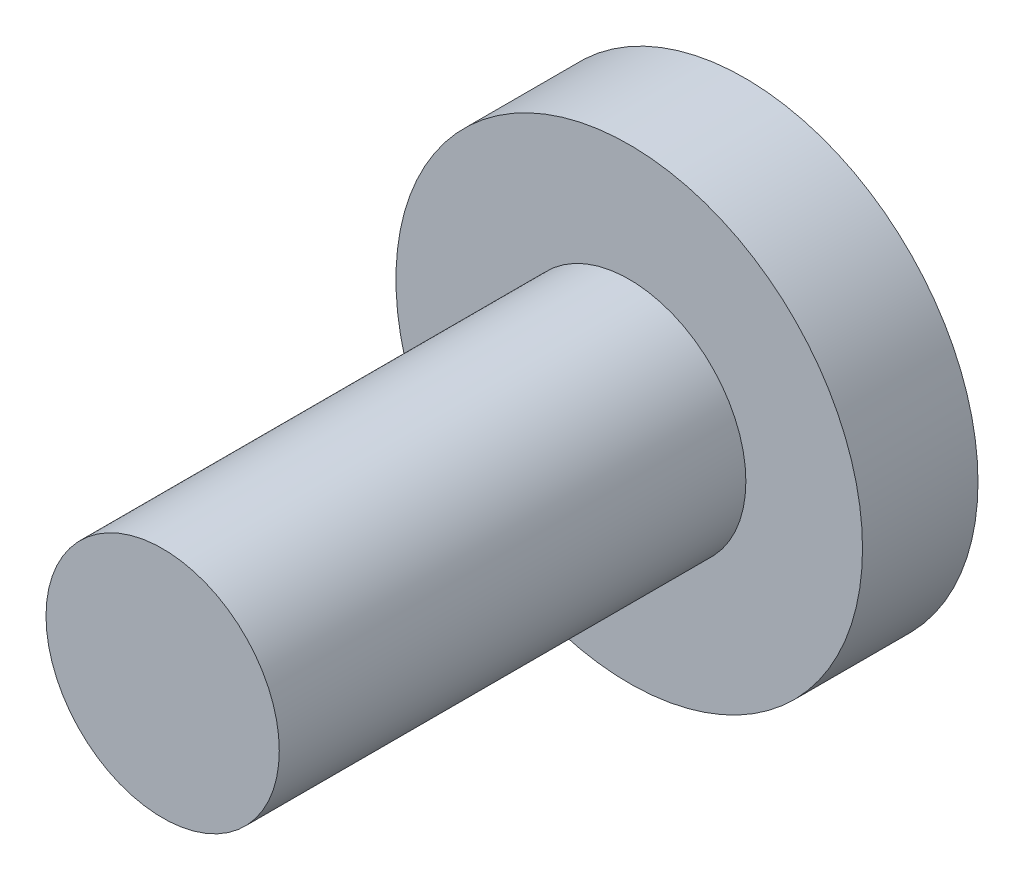
ISO-10303-21;
HEADER;
FILE_DESCRIPTION(('STEP AP214'),'2;1');
FILE_NAME('part.step','',(''),(''),'','','');
FILE_SCHEMA(('AUTOMOTIVE_DESIGN { 1 0 10303 214 1 1 1 1 }'));
ENDSEC;
DATA;
#1=APPLICATION_CONTEXT('core data for automotive mechanical design processes');
#2=APPLICATION_PROTOCOL_DEFINITION('international standard','automotive_design',2000,#1);
#3=PRODUCT_CONTEXT('',#1,'mechanical');
#4=PRODUCT('Part','Part','',(#3));
#5=PRODUCT_RELATED_PRODUCT_CATEGORY('part','',(#4));
#6=PRODUCT_DEFINITION_FORMATION('','',#4);
#7=PRODUCT_DEFINITION_CONTEXT('part definition',#1,'design');
#8=PRODUCT_DEFINITION('design','',#6,#7);
#9=PRODUCT_DEFINITION_SHAPE('','',#8);
#10=(LENGTH_UNIT() NAMED_UNIT(*) SI_UNIT(.MILLI.,.METRE.));
#11=(NAMED_UNIT(*) PLANE_ANGLE_UNIT() SI_UNIT($,.RADIAN.));
#12=(NAMED_UNIT(*) SI_UNIT($,.STERADIAN.) SOLID_ANGLE_UNIT());
#13=UNCERTAINTY_MEASURE_WITH_UNIT(LENGTH_MEASURE(1.E-05),#10,'distance_accuracy_value','');
#14=(GEOMETRIC_REPRESENTATION_CONTEXT(3) GLOBAL_UNCERTAINTY_ASSIGNED_CONTEXT((#13)) GLOBAL_UNIT_ASSIGNED_CONTEXT((#10,
#11,#12)) REPRESENTATION_CONTEXT('',''));
#15=CARTESIAN_POINT('',(0.,0.,0.));
#16=DIRECTION('',(0.,0.,1.));
#17=DIRECTION('',(1.,0.,0.));
#18=AXIS2_PLACEMENT_3D('',#15,#16,#17);
#19=CARTESIAN_POINT('',(0.,0.,50.292));
#20=DIRECTION('',(0.,0.,-1.));
#21=DIRECTION('',(-1.,0.,0.));
#22=AXIS2_PLACEMENT_3D('',#19,#20,#21);
#23=CYLINDRICAL_SURFACE('',#22,101.6);
#24=CARTESIAN_POINT('',(0.,0.,50.292));
#25=DIRECTION('',(0.,0.,1.));
#26=DIRECTION('',(1.,0.,0.));
#27=AXIS2_PLACEMENT_3D('',#24,#25,#26);
#28=CIRCLE('',#27,101.6);
#29=CARTESIAN_POINT('',(101.6,0.,50.292));
#30=VERTEX_POINT('',#29);
#31=EDGE_CURVE('E47',#30,#30,#28,.T.);
#32=ORIENTED_EDGE('',*,*,#31,.F.);
#33=EDGE_LOOP('',(#32));
#34=FACE_BOUND('',#33,.T.);
#35=CARTESIAN_POINT('',(0.,0.,0.));
#36=DIRECTION('',(0.,0.,1.));
#37=DIRECTION('',(1.,0.,0.));
#38=AXIS2_PLACEMENT_3D('',#35,#36,#37);
#39=CIRCLE('',#38,101.6);
#40=CARTESIAN_POINT('',(101.6,0.,0.));
#41=VERTEX_POINT('',#40);
#42=EDGE_CURVE('E42',#41,#41,#39,.T.);
#43=ORIENTED_EDGE('',*,*,#42,.T.);
#44=EDGE_LOOP('',(#43));
#45=FACE_BOUND('',#44,.T.);
#46=ADVANCED_FACE('F39',(#34,#45),#23,.T.);
#47=CARTESIAN_POINT('',(0.,0.,50.292));
#48=DIRECTION('',(0.,0.,1.));
#49=DIRECTION('',(1.,0.,0.));
#50=AXIS2_PLACEMENT_3D('',#47,#48,#49);
#51=PLANE('',#50);
#52=CARTESIAN_POINT('',(0.,0.,50.292));
#53=DIRECTION('',(0.,0.,1.));
#54=DIRECTION('',(1.,0.,0.));
#55=AXIS2_PLACEMENT_3D('',#52,#53,#54);
#56=CIRCLE('',#55,50.8);
#57=CARTESIAN_POINT('',(50.8,0.,50.292));
#58=VERTEX_POINT('',#57);
#59=EDGE_CURVE('E10',#58,#58,#56,.T.);
#60=ORIENTED_EDGE('',*,*,#59,.F.);
#61=EDGE_LOOP('',(#60));
#62=FACE_BOUND('',#61,.T.);
#63=ORIENTED_EDGE('',*,*,#31,.T.);
#64=EDGE_LOOP('',(#63));
#65=FACE_BOUND('',#64,.T.);
#66=ADVANCED_FACE('F67',(#62,#65),#51,.T.);
#67=CARTESIAN_POINT('',(0.,0.,0.));
#68=DIRECTION('',(0.,0.,1.));
#69=DIRECTION('',(1.,0.,0.));
#70=AXIS2_PLACEMENT_3D('',#67,#68,#69);
#71=PLANE('',#70);
#72=ORIENTED_EDGE('',*,*,#42,.F.);
#73=EDGE_LOOP('',(#72));
#74=FACE_BOUND('',#73,.T.);
#75=ADVANCED_FACE('F64',(#74),#71,.F.);
#76=CARTESIAN_POINT('',(0.,0.,253.492));
#77=DIRECTION('',(0.,0.,-1.));
#78=DIRECTION('',(-1.,0.,0.));
#79=AXIS2_PLACEMENT_3D('',#76,#77,#78);
#80=CYLINDRICAL_SURFACE('',#79,50.8);
#81=CARTESIAN_POINT('',(0.,0.,253.492));
#82=DIRECTION('',(0.,0.,1.));
#83=DIRECTION('',(1.,0.,0.));
#84=AXIS2_PLACEMENT_3D('',#81,#82,#83);
#85=CIRCLE('',#84,50.8);
#86=CARTESIAN_POINT('',(50.8,0.,253.492));
#87=VERTEX_POINT('',#86);
#88=EDGE_CURVE('E54',#87,#87,#85,.T.);
#89=ORIENTED_EDGE('',*,*,#88,.F.);
#90=EDGE_LOOP('',(#89));
#91=FACE_BOUND('',#90,.T.);
#92=ORIENTED_EDGE('',*,*,#59,.T.);
#93=EDGE_LOOP('',(#92));
#94=FACE_BOUND('',#93,.T.);
#95=ADVANCED_FACE('F66',(#91,#94),#80,.T.);
#96=CARTESIAN_POINT('',(0.,0.,253.492));
#97=DIRECTION('',(0.,0.,1.));
#98=DIRECTION('',(1.,0.,0.));
#99=AXIS2_PLACEMENT_3D('',#96,#97,#98);
#100=PLANE('',#99);
#101=ORIENTED_EDGE('',*,*,#88,.T.);
#102=EDGE_LOOP('',(#101));
#103=FACE_BOUND('',#102,.T.);
#104=ADVANCED_FACE('F72',(#103),#100,.T.);
#105=CLOSED_SHELL('',(#46,#66,#75,#95,#104));
#106=MANIFOLD_SOLID_BREP('B2',#105);
#107=ADVANCED_BREP_SHAPE_REPRESENTATION('',(#18,#106),#14);
#108=SHAPE_DEFINITION_REPRESENTATION(#9,#107);
ENDSEC;
END-ISO-10303-21;
